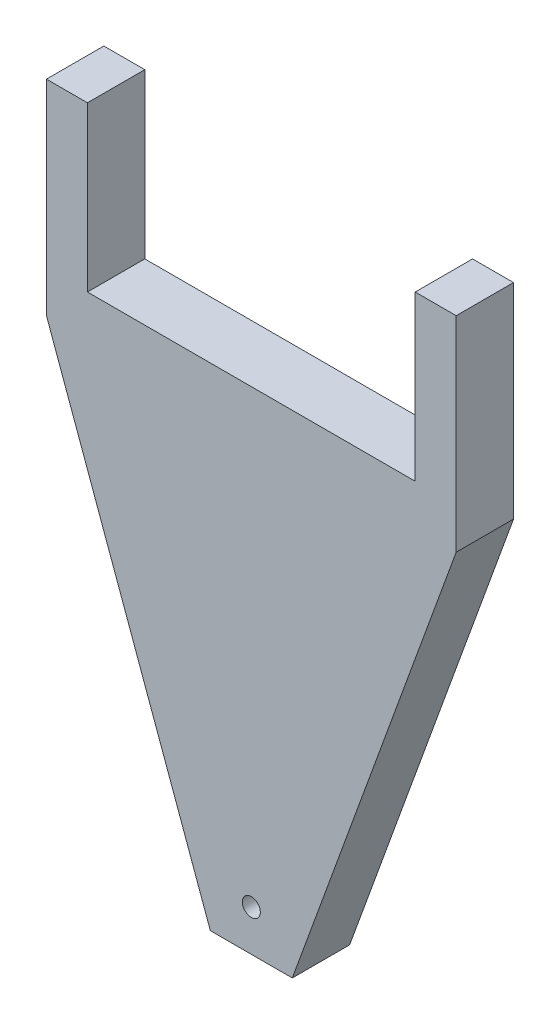
ISO-10303-21;
HEADER;
FILE_DESCRIPTION(('STEP AP214'),'2;1');
FILE_NAME('part.step','',(''),(''),'','','');
FILE_SCHEMA(('AUTOMOTIVE_DESIGN { 1 0 10303 214 1 1 1 1 }'));
ENDSEC;
DATA;
#1=APPLICATION_CONTEXT('core data for automotive mechanical design processes');
#2=APPLICATION_PROTOCOL_DEFINITION('international standard','automotive_design',2000,#1);
#3=PRODUCT_CONTEXT('',#1,'mechanical');
#4=PRODUCT('Part','Part','',(#3));
#5=PRODUCT_RELATED_PRODUCT_CATEGORY('part','',(#4));
#6=PRODUCT_DEFINITION_FORMATION('','',#4);
#7=PRODUCT_DEFINITION_CONTEXT('part definition',#1,'design');
#8=PRODUCT_DEFINITION('design','',#6,#7);
#9=PRODUCT_DEFINITION_SHAPE('','',#8);
#10=(LENGTH_UNIT() NAMED_UNIT(*) SI_UNIT(.MILLI.,.METRE.));
#11=(NAMED_UNIT(*) PLANE_ANGLE_UNIT() SI_UNIT($,.RADIAN.));
#12=(NAMED_UNIT(*) SI_UNIT($,.STERADIAN.) SOLID_ANGLE_UNIT());
#13=UNCERTAINTY_MEASURE_WITH_UNIT(LENGTH_MEASURE(1.E-05),#10,'distance_accuracy_value','');
#14=(GEOMETRIC_REPRESENTATION_CONTEXT(3) GLOBAL_UNCERTAINTY_ASSIGNED_CONTEXT((#13)) GLOBAL_UNIT_ASSIGNED_CONTEXT((#10,
#11,#12)) REPRESENTATION_CONTEXT('',''));
#15=CARTESIAN_POINT('',(0.,0.,0.));
#16=DIRECTION('',(0.,0.,1.));
#17=DIRECTION('',(1.,0.,0.));
#18=AXIS2_PLACEMENT_3D('',#15,#16,#17);
#19=CARTESIAN_POINT('',(0.,10.,7.));
#20=DIRECTION('',(0.,1.,0.));
#21=DIRECTION('',(-1.,0.,0.));
#22=AXIS2_PLACEMENT_3D('',#19,#20,#21);
#23=PLANE('',#22);
#24=DIRECTION('',(1.,0.,0.));
#25=VECTOR('',#24,1.);
#26=CARTESIAN_POINT('',(0.,10.,0.));
#27=LINE('',#26,#25);
#28=CARTESIAN_POINT('',(20.,10.,0.));
#29=VERTEX_POINT('',#28);
#30=CARTESIAN_POINT('',(25.,10.,0.));
#31=VERTEX_POINT('',#30);
#32=EDGE_CURVE('E166',#29,#31,#27,.T.);
#33=ORIENTED_EDGE('',*,*,#32,.F.);
#34=DIRECTION('',(0.,0.,-1.));
#35=VECTOR('',#34,1.);
#36=CARTESIAN_POINT('',(20.,10.,7.));
#37=LINE('',#36,#35);
#38=CARTESIAN_POINT('',(20.,10.,7.));
#39=VERTEX_POINT('',#38);
#40=EDGE_CURVE('E11',#39,#29,#37,.T.);
#41=ORIENTED_EDGE('',*,*,#40,.F.);
#42=DIRECTION('',(1.,0.,0.));
#43=VECTOR('',#42,1.);
#44=CARTESIAN_POINT('',(0.,10.,7.));
#45=LINE('',#44,#43);
#46=CARTESIAN_POINT('',(25.,10.,7.));
#47=VERTEX_POINT('',#46);
#48=EDGE_CURVE('E169',#39,#47,#45,.T.);
#49=ORIENTED_EDGE('',*,*,#48,.T.);
#50=DIRECTION('',(0.,0.,-1.));
#51=VECTOR('',#50,1.);
#52=CARTESIAN_POINT('',(25.,10.,7.));
#53=LINE('',#52,#51);
#54=EDGE_CURVE('E90',#47,#31,#53,.T.);
#55=ORIENTED_EDGE('',*,*,#54,.T.);
#56=EDGE_LOOP('',(#33,#41,#49,#55));
#57=FACE_BOUND('',#56,.T.);
#58=ADVANCED_FACE('F41',(#57),#23,.T.);
#59=CARTESIAN_POINT('',(20.,0.,7.));
#60=DIRECTION('',(1.,0.,0.));
#61=DIRECTION('',(0.,0.,-1.));
#62=AXIS2_PLACEMENT_3D('',#59,#60,#61);
#63=PLANE('',#62);
#64=DIRECTION('',(0.,-1.,0.));
#65=VECTOR('',#64,1.);
#66=CARTESIAN_POINT('',(20.,0.,0.));
#67=LINE('',#66,#65);
#68=CARTESIAN_POINT('',(20.,-10.,0.));
#69=VERTEX_POINT('',#68);
#70=EDGE_CURVE('E191',#29,#69,#67,.T.);
#71=ORIENTED_EDGE('',*,*,#70,.T.);
#72=DIRECTION('',(0.,0.,-1.));
#73=VECTOR('',#72,1.);
#74=CARTESIAN_POINT('',(20.,-10.,7.));
#75=LINE('',#74,#73);
#76=CARTESIAN_POINT('',(20.,-10.,7.));
#77=VERTEX_POINT('',#76);
#78=EDGE_CURVE('E50',#77,#69,#75,.T.);
#79=ORIENTED_EDGE('',*,*,#78,.F.);
#80=DIRECTION('',(0.,-1.,0.));
#81=VECTOR('',#80,1.);
#82=CARTESIAN_POINT('',(20.,0.,7.));
#83=LINE('',#82,#81);
#84=EDGE_CURVE('E172',#39,#77,#83,.T.);
#85=ORIENTED_EDGE('',*,*,#84,.F.);
#86=ORIENTED_EDGE('',*,*,#40,.T.);
#87=EDGE_LOOP('',(#71,#79,#85,#86));
#88=FACE_BOUND('',#87,.T.);
#89=ADVANCED_FACE('F230',(#88),#63,.F.);
#90=CARTESIAN_POINT('',(0.,-10.,7.));
#91=DIRECTION('',(0.,1.,0.));
#92=DIRECTION('',(0.,0.,1.));
#93=AXIS2_PLACEMENT_3D('',#90,#91,#92);
#94=PLANE('',#93);
#95=DIRECTION('',(1.,0.,0.));
#96=VECTOR('',#95,1.);
#97=CARTESIAN_POINT('',(0.,-10.,0.));
#98=LINE('',#97,#96);
#99=CARTESIAN_POINT('',(-20.,-10.,0.));
#100=VERTEX_POINT('',#99);
#101=EDGE_CURVE('E195',#100,#69,#98,.T.);
#102=ORIENTED_EDGE('',*,*,#101,.F.);
#103=DIRECTION('',(0.,0.,-1.));
#104=VECTOR('',#103,1.);
#105=CARTESIAN_POINT('',(-20.,-10.,7.));
#106=LINE('',#105,#104);
#107=CARTESIAN_POINT('',(-20.,-10.,7.));
#108=VERTEX_POINT('',#107);
#109=EDGE_CURVE('E220',#108,#100,#106,.T.);
#110=ORIENTED_EDGE('',*,*,#109,.F.);
#111=DIRECTION('',(1.,0.,0.));
#112=VECTOR('',#111,1.);
#113=CARTESIAN_POINT('',(0.,-10.,7.));
#114=LINE('',#113,#112);
#115=EDGE_CURVE('E176',#108,#77,#114,.T.);
#116=ORIENTED_EDGE('',*,*,#115,.T.);
#117=ORIENTED_EDGE('',*,*,#78,.T.);
#118=EDGE_LOOP('',(#102,#110,#116,#117));
#119=FACE_BOUND('',#118,.T.);
#120=ADVANCED_FACE('F226',(#119),#94,.T.);
#121=CARTESIAN_POINT('',(-20.,0.,7.));
#122=DIRECTION('',(1.,0.,0.));
#123=DIRECTION('',(0.,0.,-1.));
#124=AXIS2_PLACEMENT_3D('',#121,#122,#123);
#125=PLANE('',#124);
#126=DIRECTION('',(0.,-1.,0.));
#127=VECTOR('',#126,1.);
#128=CARTESIAN_POINT('',(-20.,0.,0.));
#129=LINE('',#128,#127);
#130=CARTESIAN_POINT('',(-20.,10.,0.));
#131=VERTEX_POINT('',#130);
#132=EDGE_CURVE('E199',#131,#100,#129,.T.);
#133=ORIENTED_EDGE('',*,*,#132,.F.);
#134=DIRECTION('',(0.,0.,-1.));
#135=VECTOR('',#134,1.);
#136=CARTESIAN_POINT('',(-20.,10.,7.));
#137=LINE('',#136,#135);
#138=CARTESIAN_POINT('',(-20.,10.,7.));
#139=VERTEX_POINT('',#138);
#140=EDGE_CURVE('E217',#139,#131,#137,.T.);
#141=ORIENTED_EDGE('',*,*,#140,.F.);
#142=DIRECTION('',(0.,-1.,0.));
#143=VECTOR('',#142,1.);
#144=CARTESIAN_POINT('',(-20.,0.,7.));
#145=LINE('',#144,#143);
#146=EDGE_CURVE('E180',#139,#108,#145,.T.);
#147=ORIENTED_EDGE('',*,*,#146,.T.);
#148=ORIENTED_EDGE('',*,*,#109,.T.);
#149=EDGE_LOOP('',(#133,#141,#147,#148));
#150=FACE_BOUND('',#149,.T.);
#151=ADVANCED_FACE('F237',(#150),#125,.T.);
#152=CARTESIAN_POINT('',(0.,10.,7.));
#153=DIRECTION('',(0.,-1.,0.));
#154=DIRECTION('',(1.,0.,0.));
#155=AXIS2_PLACEMENT_3D('',#152,#153,#154);
#156=PLANE('',#155);
#157=DIRECTION('',(-1.,0.,0.));
#158=VECTOR('',#157,1.);
#159=CARTESIAN_POINT('',(0.,10.,0.));
#160=LINE('',#159,#158);
#161=CARTESIAN_POINT('',(-25.,9.99999999999999,0.));
#162=VERTEX_POINT('',#161);
#163=EDGE_CURVE('E203',#131,#162,#160,.T.);
#164=ORIENTED_EDGE('',*,*,#163,.T.);
#165=DIRECTION('',(0.,0.,-1.));
#166=VECTOR('',#165,1.);
#167=CARTESIAN_POINT('',(-25.,9.99999999999999,7.));
#168=LINE('',#167,#166);
#169=CARTESIAN_POINT('',(-25.,9.99999999999999,7.));
#170=VERTEX_POINT('',#169);
#171=EDGE_CURVE('E125',#170,#162,#168,.T.);
#172=ORIENTED_EDGE('',*,*,#171,.F.);
#173=DIRECTION('',(-1.,0.,0.));
#174=VECTOR('',#173,1.);
#175=CARTESIAN_POINT('',(0.,10.,7.));
#176=LINE('',#175,#174);
#177=EDGE_CURVE('E135',#139,#170,#176,.T.);
#178=ORIENTED_EDGE('',*,*,#177,.F.);
#179=ORIENTED_EDGE('',*,*,#140,.T.);
#180=EDGE_LOOP('',(#164,#172,#178,#179));
#181=FACE_BOUND('',#180,.T.);
#182=ADVANCED_FACE('F249',(#181),#156,.F.);
#183=CARTESIAN_POINT('',(-25.,0.,7.));
#184=DIRECTION('',(-1.,0.,0.));
#185=DIRECTION('',(0.,0.,1.));
#186=AXIS2_PLACEMENT_3D('',#183,#184,#185);
#187=PLANE('',#186);
#188=DIRECTION('',(0.,1.,0.));
#189=VECTOR('',#188,1.);
#190=CARTESIAN_POINT('',(-25.,0.,0.));
#191=LINE('',#190,#189);
#192=CARTESIAN_POINT('',(-25.,-15.,0.));
#193=VERTEX_POINT('',#192);
#194=EDGE_CURVE('E119',#193,#162,#191,.T.);
#195=ORIENTED_EDGE('',*,*,#194,.F.);
#196=DIRECTION('',(0.,0.,-1.));
#197=VECTOR('',#196,1.);
#198=CARTESIAN_POINT('',(-25.,-15.,7.));
#199=LINE('',#198,#197);
#200=CARTESIAN_POINT('',(-25.,-15.,7.));
#201=VERTEX_POINT('',#200);
#202=EDGE_CURVE('E114',#201,#193,#199,.T.);
#203=ORIENTED_EDGE('',*,*,#202,.F.);
#204=DIRECTION('',(0.,1.,0.));
#205=VECTOR('',#204,1.);
#206=CARTESIAN_POINT('',(-25.,0.,7.));
#207=LINE('',#206,#205);
#208=EDGE_CURVE('E117',#201,#170,#207,.T.);
#209=ORIENTED_EDGE('',*,*,#208,.T.);
#210=ORIENTED_EDGE('',*,*,#171,.T.);
#211=EDGE_LOOP('',(#195,#203,#209,#210));
#212=FACE_BOUND('',#211,.T.);
#213=ADVANCED_FACE('F116',(#212),#187,.T.);
#214=CARTESIAN_POINT('',(25.,0.,7.));
#215=DIRECTION('',(-1.,0.,0.));
#216=DIRECTION('',(0.,0.,1.));
#217=AXIS2_PLACEMENT_3D('',#214,#215,#216);
#218=PLANE('',#217);
#219=DIRECTION('',(0.,1.,0.));
#220=VECTOR('',#219,1.);
#221=CARTESIAN_POINT('',(25.,0.,0.));
#222=LINE('',#221,#220);
#223=CARTESIAN_POINT('',(25.,-15.,0.));
#224=VERTEX_POINT('',#223);
#225=EDGE_CURVE('E173',#224,#31,#222,.T.);
#226=ORIENTED_EDGE('',*,*,#225,.T.);
#227=ORIENTED_EDGE('',*,*,#54,.F.);
#228=DIRECTION('',(0.,1.,0.));
#229=VECTOR('',#228,1.);
#230=CARTESIAN_POINT('',(25.,0.,7.));
#231=LINE('',#230,#229);
#232=CARTESIAN_POINT('',(25.,-15.,7.));
#233=VERTEX_POINT('',#232);
#234=EDGE_CURVE('E58',#233,#47,#231,.T.);
#235=ORIENTED_EDGE('',*,*,#234,.F.);
#236=DIRECTION('',(0.,0.,-1.));
#237=VECTOR('',#236,1.);
#238=CARTESIAN_POINT('',(25.,-15.,7.));
#239=LINE('',#238,#237);
#240=EDGE_CURVE('E83',#233,#224,#239,.T.);
#241=ORIENTED_EDGE('',*,*,#240,.T.);
#242=EDGE_LOOP('',(#226,#227,#235,#241));
#243=FACE_BOUND('',#242,.T.);
#244=ADVANCED_FACE('F255',(#243),#218,.F.);
#245=CARTESIAN_POINT('',(0.,0.,7.));
#246=DIRECTION('',(0.,0.,1.));
#247=DIRECTION('',(1.,0.,0.));
#248=AXIS2_PLACEMENT_3D('',#245,#246,#247);
#249=PLANE('',#248);
#250=ORIENTED_EDGE('',*,*,#48,.F.);
#251=ORIENTED_EDGE('',*,*,#84,.T.);
#252=ORIENTED_EDGE('',*,*,#115,.F.);
#253=ORIENTED_EDGE('',*,*,#146,.F.);
#254=ORIENTED_EDGE('',*,*,#177,.T.);
#255=ORIENTED_EDGE('',*,*,#208,.F.);
#256=DIRECTION('',(-0.341743063086704,0.939793423488437,0.));
#257=VECTOR('',#256,1.);
#258=CARTESIAN_POINT('',(-26.8978102189781,-9.78102189781022,7.));
#259=LINE('',#258,#257);
#260=CARTESIAN_POINT('',(-4.99999999999999,-70.,7.));
#261=VERTEX_POINT('',#260);
#262=EDGE_CURVE('E132',#261,#201,#259,.T.);
#263=ORIENTED_EDGE('',*,*,#262,.F.);
#264=DIRECTION('',(-1.,0.,0.));
#265=VECTOR('',#264,1.);
#266=CARTESIAN_POINT('',(0.,-70.,7.));
#267=LINE('',#266,#265);
#268=CARTESIAN_POINT('',(5.00000000000001,-70.,7.));
#269=VERTEX_POINT('',#268);
#270=EDGE_CURVE('E144',#269,#261,#267,.T.);
#271=ORIENTED_EDGE('',*,*,#270,.F.);
#272=DIRECTION('',(-0.341743063086704,-0.939793423488437,0.));
#273=VECTOR('',#272,1.);
#274=CARTESIAN_POINT('',(26.8978102189781,-9.78102189781021,7.));
#275=LINE('',#274,#273);
#276=EDGE_CURVE('E148',#233,#269,#275,.T.);
#277=ORIENTED_EDGE('',*,*,#276,.F.);
#278=ORIENTED_EDGE('',*,*,#234,.T.);
#279=EDGE_LOOP('',(#250,#251,#252,#253,#254,#255,#263,#271,#277,#278));
#280=FACE_BOUND('',#279,.T.);
#281=CARTESIAN_POINT('',(0.,-65.,7.));
#282=DIRECTION('',(0.,0.,1.));
#283=DIRECTION('',(1.,0.,0.));
#284=AXIS2_PLACEMENT_3D('',#281,#282,#283);
#285=CIRCLE('',#284,1.1);
#286=CARTESIAN_POINT('',(1.10000000000001,-65.,7.));
#287=VERTEX_POINT('',#286);
#288=EDGE_CURVE('E157',#287,#287,#285,.T.);
#289=ORIENTED_EDGE('',*,*,#288,.F.);
#290=EDGE_LOOP('',(#289));
#291=FACE_BOUND('',#290,.T.);
#292=ADVANCED_FACE('F128',(#280,#291),#249,.T.);
#293=CARTESIAN_POINT('',(0.,0.,0.));
#294=DIRECTION('',(0.,0.,1.));
#295=DIRECTION('',(1.,0.,0.));
#296=AXIS2_PLACEMENT_3D('',#293,#294,#295);
#297=PLANE('',#296);
#298=ORIENTED_EDGE('',*,*,#32,.T.);
#299=ORIENTED_EDGE('',*,*,#225,.F.);
#300=DIRECTION('',(-0.341743063086704,-0.939793423488437,0.));
#301=VECTOR('',#300,1.);
#302=CARTESIAN_POINT('',(26.8978102189781,-9.78102189781021,0.));
#303=LINE('',#302,#301);
#304=CARTESIAN_POINT('',(5.00000000000001,-70.,0.));
#305=VERTEX_POINT('',#304);
#306=EDGE_CURVE('E282',#224,#305,#303,.T.);
#307=ORIENTED_EDGE('',*,*,#306,.T.);
#308=DIRECTION('',(-1.,0.,0.));
#309=VECTOR('',#308,1.);
#310=CARTESIAN_POINT('',(0.,-70.,0.));
#311=LINE('',#310,#309);
#312=CARTESIAN_POINT('',(-4.99999999999999,-70.,0.));
#313=VERTEX_POINT('',#312);
#314=EDGE_CURVE('E285',#305,#313,#311,.T.);
#315=ORIENTED_EDGE('',*,*,#314,.T.);
#316=DIRECTION('',(-0.341743063086704,0.939793423488437,0.));
#317=VECTOR('',#316,1.);
#318=CARTESIAN_POINT('',(-26.8978102189781,-9.78102189781022,0.));
#319=LINE('',#318,#317);
#320=EDGE_CURVE('E161',#313,#193,#319,.T.);
#321=ORIENTED_EDGE('',*,*,#320,.T.);
#322=ORIENTED_EDGE('',*,*,#194,.T.);
#323=ORIENTED_EDGE('',*,*,#163,.F.);
#324=ORIENTED_EDGE('',*,*,#132,.T.);
#325=ORIENTED_EDGE('',*,*,#101,.T.);
#326=ORIENTED_EDGE('',*,*,#70,.F.);
#327=EDGE_LOOP('',(#298,#299,#307,#315,#321,#322,#323,#324,#325,#326));
#328=FACE_BOUND('',#327,.T.);
#329=CARTESIAN_POINT('',(0.,-65.,0.));
#330=DIRECTION('',(0.,0.,1.));
#331=DIRECTION('',(1.,0.,0.));
#332=AXIS2_PLACEMENT_3D('',#329,#330,#331);
#333=CIRCLE('',#332,1.1);
#334=CARTESIAN_POINT('',(1.10000000000001,-65.,0.));
#335=VERTEX_POINT('',#334);
#336=EDGE_CURVE('E151',#335,#335,#333,.T.);
#337=ORIENTED_EDGE('',*,*,#336,.T.);
#338=EDGE_LOOP('',(#337));
#339=FACE_BOUND('',#338,.T.);
#340=ADVANCED_FACE('F232',(#328,#339),#297,.F.);
#341=CARTESIAN_POINT('',(-26.8978102189781,-9.78102189781022,0.));
#342=DIRECTION('',(0.939793423488437,0.341743063086704,0.));
#343=DIRECTION('',(-0.341743063086704,0.939793423488437,0.));
#344=AXIS2_PLACEMENT_3D('',#341,#342,#343);
#345=PLANE('',#344);
#346=ORIENTED_EDGE('',*,*,#262,.T.);
#347=ORIENTED_EDGE('',*,*,#202,.T.);
#348=ORIENTED_EDGE('',*,*,#320,.F.);
#349=DIRECTION('',(0.,0.,1.));
#350=VECTOR('',#349,1.);
#351=CARTESIAN_POINT('',(-4.99999999999999,-70.,0.));
#352=LINE('',#351,#350);
#353=EDGE_CURVE('E142',#313,#261,#352,.T.);
#354=ORIENTED_EDGE('',*,*,#353,.T.);
#355=EDGE_LOOP('',(#346,#347,#348,#354));
#356=FACE_BOUND('',#355,.T.);
#357=ADVANCED_FACE('F140',(#356),#345,.F.);
#358=CARTESIAN_POINT('',(26.8978102189781,-9.78102189781021,0.));
#359=DIRECTION('',(-0.939793423488437,0.341743063086704,0.));
#360=DIRECTION('',(-0.341743063086704,-0.939793423488437,0.));
#361=AXIS2_PLACEMENT_3D('',#358,#359,#360);
#362=PLANE('',#361);
#363=ORIENTED_EDGE('',*,*,#276,.T.);
#364=DIRECTION('',(0.,0.,1.));
#365=VECTOR('',#364,1.);
#366=CARTESIAN_POINT('',(5.00000000000001,-70.,0.));
#367=LINE('',#366,#365);
#368=EDGE_CURVE('E162',#305,#269,#367,.T.);
#369=ORIENTED_EDGE('',*,*,#368,.F.);
#370=ORIENTED_EDGE('',*,*,#306,.F.);
#371=ORIENTED_EDGE('',*,*,#240,.F.);
#372=EDGE_LOOP('',(#363,#369,#370,#371));
#373=FACE_BOUND('',#372,.T.);
#374=ADVANCED_FACE('F264',(#373),#362,.F.);
#375=CARTESIAN_POINT('',(0.,-70.,0.));
#376=DIRECTION('',(0.,1.,0.));
#377=DIRECTION('',(0.,0.,1.));
#378=AXIS2_PLACEMENT_3D('',#375,#376,#377);
#379=PLANE('',#378);
#380=ORIENTED_EDGE('',*,*,#270,.T.);
#381=ORIENTED_EDGE('',*,*,#353,.F.);
#382=ORIENTED_EDGE('',*,*,#314,.F.);
#383=ORIENTED_EDGE('',*,*,#368,.T.);
#384=EDGE_LOOP('',(#380,#381,#382,#383));
#385=FACE_BOUND('',#384,.T.);
#386=ADVANCED_FACE('F265',(#385),#379,.F.);
#387=CARTESIAN_POINT('',(0.,-65.,0.));
#388=DIRECTION('',(0.,0.,1.));
#389=DIRECTION('',(1.,0.,0.));
#390=AXIS2_PLACEMENT_3D('',#387,#388,#389);
#391=CYLINDRICAL_SURFACE('',#390,1.1);
#392=ORIENTED_EDGE('',*,*,#336,.F.);
#393=EDGE_LOOP('',(#392));
#394=FACE_BOUND('',#393,.T.);
#395=ORIENTED_EDGE('',*,*,#288,.T.);
#396=EDGE_LOOP('',(#395));
#397=FACE_BOUND('',#396,.T.);
#398=ADVANCED_FACE('F268',(#394,#397),#391,.F.);
#399=CLOSED_SHELL('',(#58,#89,#120,#151,#182,#213,#244,#292,#340,#357,#374,#386,#398));
#400=MANIFOLD_SOLID_BREP('B2',#399);
#401=ADVANCED_BREP_SHAPE_REPRESENTATION('',(#18,#400),#14);
#402=SHAPE_DEFINITION_REPRESENTATION(#9,#401);
ENDSEC;
END-ISO-10303-21;
